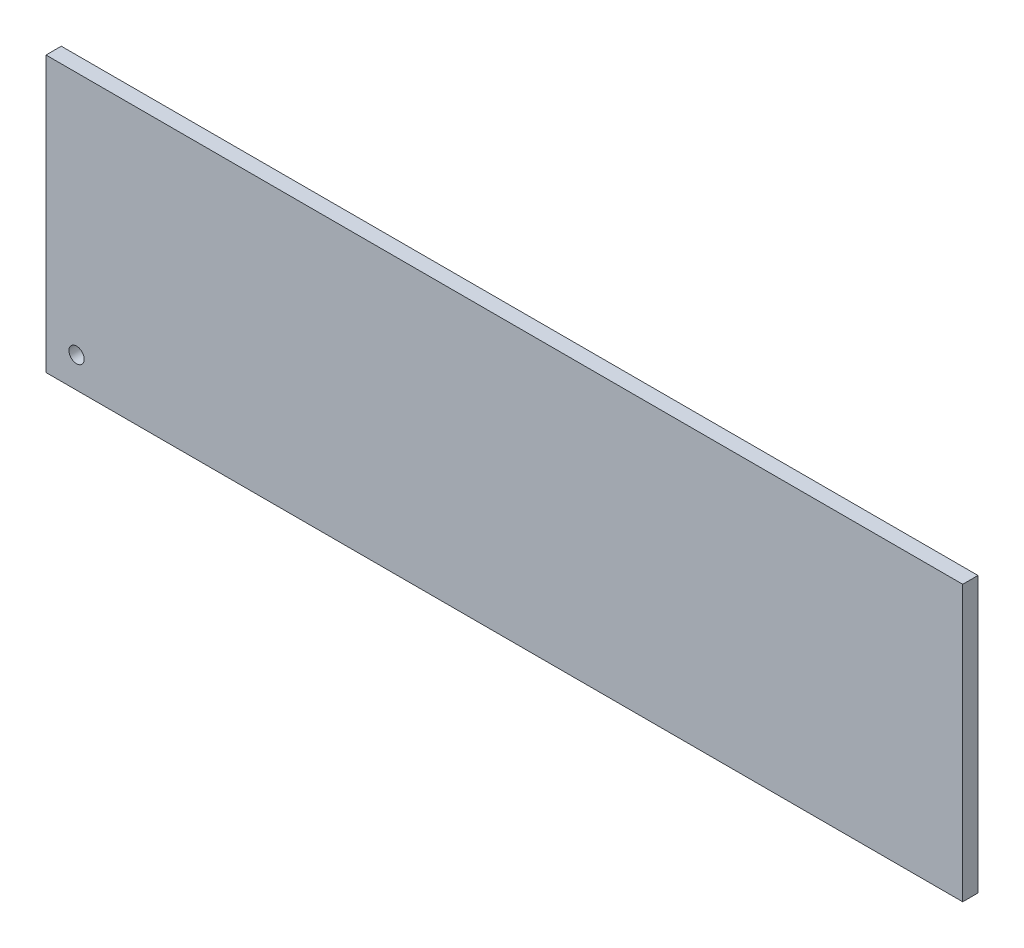
ISO-10303-21;
HEADER;
FILE_DESCRIPTION(('STEP AP214'),'2;1');
FILE_NAME('part.step','',(''),(''),'','','');
FILE_SCHEMA(('AUTOMOTIVE_DESIGN { 1 0 10303 214 1 1 1 1 }'));
ENDSEC;
DATA;
#1=APPLICATION_CONTEXT('core data for automotive mechanical design processes');
#2=APPLICATION_PROTOCOL_DEFINITION('international standard','automotive_design',2000,#1);
#3=PRODUCT_CONTEXT('',#1,'mechanical');
#4=PRODUCT('Part','Part','',(#3));
#5=PRODUCT_RELATED_PRODUCT_CATEGORY('part','',(#4));
#6=PRODUCT_DEFINITION_FORMATION('','',#4);
#7=PRODUCT_DEFINITION_CONTEXT('part definition',#1,'design');
#8=PRODUCT_DEFINITION('design','',#6,#7);
#9=PRODUCT_DEFINITION_SHAPE('','',#8);
#10=(LENGTH_UNIT() NAMED_UNIT(*) SI_UNIT(.MILLI.,.METRE.));
#11=(NAMED_UNIT(*) PLANE_ANGLE_UNIT() SI_UNIT($,.RADIAN.));
#12=(NAMED_UNIT(*) SI_UNIT($,.STERADIAN.) SOLID_ANGLE_UNIT());
#13=UNCERTAINTY_MEASURE_WITH_UNIT(LENGTH_MEASURE(1.E-05),#10,'distance_accuracy_value','');
#14=(GEOMETRIC_REPRESENTATION_CONTEXT(3) GLOBAL_UNCERTAINTY_ASSIGNED_CONTEXT((#13)) GLOBAL_UNIT_ASSIGNED_CONTEXT((#10,
#11,#12)) REPRESENTATION_CONTEXT('',''));
#15=CARTESIAN_POINT('',(0.,0.,0.));
#16=DIRECTION('',(0.,0.,1.));
#17=DIRECTION('',(1.,0.,0.));
#18=AXIS2_PLACEMENT_3D('',#15,#16,#17);
#19=CARTESIAN_POINT('',(0.,0.,2.5));
#20=DIRECTION('',(1.,0.,0.));
#21=DIRECTION('',(0.,0.,-1.));
#22=AXIS2_PLACEMENT_3D('',#19,#20,#21);
#23=PLANE('',#22);
#24=DIRECTION('',(0.,-1.,0.));
#25=VECTOR('',#24,1.);
#26=CARTESIAN_POINT('',(0.,0.,-2.5));
#27=LINE('',#26,#25);
#28=CARTESIAN_POINT('',(0.,90.,-2.5));
#29=VERTEX_POINT('',#28);
#30=CARTESIAN_POINT('',(0.,0.,-2.5));
#31=VERTEX_POINT('',#30);
#32=EDGE_CURVE('E109',#29,#31,#27,.T.);
#33=ORIENTED_EDGE('',*,*,#32,.T.);
#34=DIRECTION('',(0.,0.,-1.));
#35=VECTOR('',#34,1.);
#36=CARTESIAN_POINT('',(0.,0.,2.5));
#37=LINE('',#36,#35);
#38=CARTESIAN_POINT('',(0.,0.,2.5));
#39=VERTEX_POINT('',#38);
#40=EDGE_CURVE('E11',#39,#31,#37,.T.);
#41=ORIENTED_EDGE('',*,*,#40,.F.);
#42=DIRECTION('',(0.,-1.,0.));
#43=VECTOR('',#42,1.);
#44=CARTESIAN_POINT('',(0.,0.,2.5));
#45=LINE('',#44,#43);
#46=CARTESIAN_POINT('',(0.,90.,2.5));
#47=VERTEX_POINT('',#46);
#48=EDGE_CURVE('E93',#47,#39,#45,.T.);
#49=ORIENTED_EDGE('',*,*,#48,.F.);
#50=DIRECTION('',(0.,0.,-1.));
#51=VECTOR('',#50,1.);
#52=CARTESIAN_POINT('',(0.,90.,2.5));
#53=LINE('',#52,#51);
#54=EDGE_CURVE('E105',#47,#29,#53,.T.);
#55=ORIENTED_EDGE('',*,*,#54,.T.);
#56=EDGE_LOOP('',(#33,#41,#49,#55));
#57=FACE_BOUND('',#56,.T.);
#58=ADVANCED_FACE('F41',(#57),#23,.F.);
#59=CARTESIAN_POINT('',(0.,0.,2.5));
#60=DIRECTION('',(0.,1.,0.));
#61=DIRECTION('',(0.,0.,1.));
#62=AXIS2_PLACEMENT_3D('',#59,#60,#61);
#63=PLANE('',#62);
#64=DIRECTION('',(1.,0.,0.));
#65=VECTOR('',#64,1.);
#66=CARTESIAN_POINT('',(0.,0.,-2.5));
#67=LINE('',#66,#65);
#68=CARTESIAN_POINT('',(300.,0.,-2.5));
#69=VERTEX_POINT('',#68);
#70=EDGE_CURVE('E98',#31,#69,#67,.T.);
#71=ORIENTED_EDGE('',*,*,#70,.T.);
#72=DIRECTION('',(0.,0.,-1.));
#73=VECTOR('',#72,1.);
#74=CARTESIAN_POINT('',(300.,0.,2.5));
#75=LINE('',#74,#73);
#76=CARTESIAN_POINT('',(300.,0.,2.5));
#77=VERTEX_POINT('',#76);
#78=EDGE_CURVE('E50',#77,#69,#75,.T.);
#79=ORIENTED_EDGE('',*,*,#78,.F.);
#80=DIRECTION('',(1.,0.,0.));
#81=VECTOR('',#80,1.);
#82=CARTESIAN_POINT('',(0.,0.,2.5));
#83=LINE('',#82,#81);
#84=EDGE_CURVE('E88',#39,#77,#83,.T.);
#85=ORIENTED_EDGE('',*,*,#84,.F.);
#86=ORIENTED_EDGE('',*,*,#40,.T.);
#87=EDGE_LOOP('',(#71,#79,#85,#86));
#88=FACE_BOUND('',#87,.T.);
#89=ADVANCED_FACE('F97',(#88),#63,.F.);
#90=CARTESIAN_POINT('',(300.,0.,2.5));
#91=DIRECTION('',(-1.,0.,0.));
#92=DIRECTION('',(0.,0.,1.));
#93=AXIS2_PLACEMENT_3D('',#90,#91,#92);
#94=PLANE('',#93);
#95=DIRECTION('',(0.,1.,0.));
#96=VECTOR('',#95,1.);
#97=CARTESIAN_POINT('',(300.,0.,-2.5));
#98=LINE('',#97,#96);
#99=CARTESIAN_POINT('',(300.,90.,-2.5));
#100=VERTEX_POINT('',#99);
#101=EDGE_CURVE('E75',#69,#100,#98,.T.);
#102=ORIENTED_EDGE('',*,*,#101,.T.);
#103=DIRECTION('',(0.,0.,-1.));
#104=VECTOR('',#103,1.);
#105=CARTESIAN_POINT('',(300.,90.,2.5));
#106=LINE('',#105,#104);
#107=CARTESIAN_POINT('',(300.,90.,2.5));
#108=VERTEX_POINT('',#107);
#109=EDGE_CURVE('E100',#108,#100,#106,.T.);
#110=ORIENTED_EDGE('',*,*,#109,.F.);
#111=DIRECTION('',(0.,1.,0.));
#112=VECTOR('',#111,1.);
#113=CARTESIAN_POINT('',(300.,0.,2.5));
#114=LINE('',#113,#112);
#115=EDGE_CURVE('E91',#77,#108,#114,.T.);
#116=ORIENTED_EDGE('',*,*,#115,.F.);
#117=ORIENTED_EDGE('',*,*,#78,.T.);
#118=EDGE_LOOP('',(#102,#110,#116,#117));
#119=FACE_BOUND('',#118,.T.);
#120=ADVANCED_FACE('F101',(#119),#94,.F.);
#121=CARTESIAN_POINT('',(0.,90.,2.5));
#122=DIRECTION('',(0.,-1.,0.));
#123=DIRECTION('',(0.,0.,-1.));
#124=AXIS2_PLACEMENT_3D('',#121,#122,#123);
#125=PLANE('',#124);
#126=DIRECTION('',(-1.,0.,0.));
#127=VECTOR('',#126,1.);
#128=CARTESIAN_POINT('',(0.,90.,-2.5));
#129=LINE('',#128,#127);
#130=EDGE_CURVE('E81',#100,#29,#129,.T.);
#131=ORIENTED_EDGE('',*,*,#130,.T.);
#132=ORIENTED_EDGE('',*,*,#54,.F.);
#133=DIRECTION('',(-1.,0.,0.));
#134=VECTOR('',#133,1.);
#135=CARTESIAN_POINT('',(0.,90.,2.5));
#136=LINE('',#135,#134);
#137=EDGE_CURVE('E58',#108,#47,#136,.T.);
#138=ORIENTED_EDGE('',*,*,#137,.F.);
#139=ORIENTED_EDGE('',*,*,#109,.T.);
#140=EDGE_LOOP('',(#131,#132,#138,#139));
#141=FACE_BOUND('',#140,.T.);
#142=ADVANCED_FACE('F123',(#141),#125,.F.);
#143=CARTESIAN_POINT('',(0.,0.,2.5));
#144=DIRECTION('',(0.,0.,-1.));
#145=DIRECTION('',(-1.,0.,0.));
#146=AXIS2_PLACEMENT_3D('',#143,#144,#145);
#147=PLANE('',#146);
#148=CARTESIAN_POINT('',(10.,9.99999999999999,2.5));
#149=DIRECTION('',(0.,0.,1.));
#150=DIRECTION('',(1.,0.,0.));
#151=AXIS2_PLACEMENT_3D('',#148,#149,#150);
#152=CIRCLE('',#151,2.5);
#153=CARTESIAN_POINT('',(12.5,9.99999999999999,2.5));
#154=VERTEX_POINT('',#153);
#155=EDGE_CURVE('E130',#154,#154,#152,.T.);
#156=ORIENTED_EDGE('',*,*,#155,.F.);
#157=EDGE_LOOP('',(#156));
#158=FACE_BOUND('',#157,.T.);
#159=ORIENTED_EDGE('',*,*,#48,.T.);
#160=ORIENTED_EDGE('',*,*,#84,.T.);
#161=ORIENTED_EDGE('',*,*,#115,.T.);
#162=ORIENTED_EDGE('',*,*,#137,.T.);
#163=EDGE_LOOP('',(#159,#160,#161,#162));
#164=FACE_BOUND('',#163,.T.);
#165=ADVANCED_FACE('F89',(#158,#164),#147,.F.);
#166=CARTESIAN_POINT('',(0.,0.,-2.5));
#167=DIRECTION('',(0.,0.,-1.));
#168=DIRECTION('',(-1.,0.,0.));
#169=AXIS2_PLACEMENT_3D('',#166,#167,#168);
#170=PLANE('',#169);
#171=CARTESIAN_POINT('',(10.,9.99999999999999,-2.5));
#172=DIRECTION('',(0.,0.,1.));
#173=DIRECTION('',(1.,0.,0.));
#174=AXIS2_PLACEMENT_3D('',#171,#172,#173);
#175=CIRCLE('',#174,2.5);
#176=CARTESIAN_POINT('',(12.5,9.99999999999999,-2.5));
#177=VERTEX_POINT('',#176);
#178=EDGE_CURVE('E113',#177,#177,#175,.T.);
#179=ORIENTED_EDGE('',*,*,#178,.T.);
#180=EDGE_LOOP('',(#179));
#181=FACE_BOUND('',#180,.T.);
#182=ORIENTED_EDGE('',*,*,#32,.F.);
#183=ORIENTED_EDGE('',*,*,#130,.F.);
#184=ORIENTED_EDGE('',*,*,#101,.F.);
#185=ORIENTED_EDGE('',*,*,#70,.F.);
#186=EDGE_LOOP('',(#182,#183,#184,#185));
#187=FACE_BOUND('',#186,.T.);
#188=ADVANCED_FACE('F126',(#181,#187),#170,.T.);
#189=CARTESIAN_POINT('',(10.,9.99999999999999,-2.5));
#190=DIRECTION('',(0.,0.,1.));
#191=DIRECTION('',(1.,0.,0.));
#192=AXIS2_PLACEMENT_3D('',#189,#190,#191);
#193=CYLINDRICAL_SURFACE('',#192,2.5);
#194=ORIENTED_EDGE('',*,*,#178,.F.);
#195=EDGE_LOOP('',(#194));
#196=FACE_BOUND('',#195,.T.);
#197=ORIENTED_EDGE('',*,*,#155,.T.);
#198=EDGE_LOOP('',(#197));
#199=FACE_BOUND('',#198,.T.);
#200=ADVANCED_FACE('F139',(#196,#199),#193,.F.);
#201=CLOSED_SHELL('',(#58,#89,#120,#142,#165,#188,#200));
#202=MANIFOLD_SOLID_BREP('B2',#201);
#203=ADVANCED_BREP_SHAPE_REPRESENTATION('',(#18,#202),#14);
#204=SHAPE_DEFINITION_REPRESENTATION(#9,#203);
ENDSEC;
END-ISO-10303-21;
